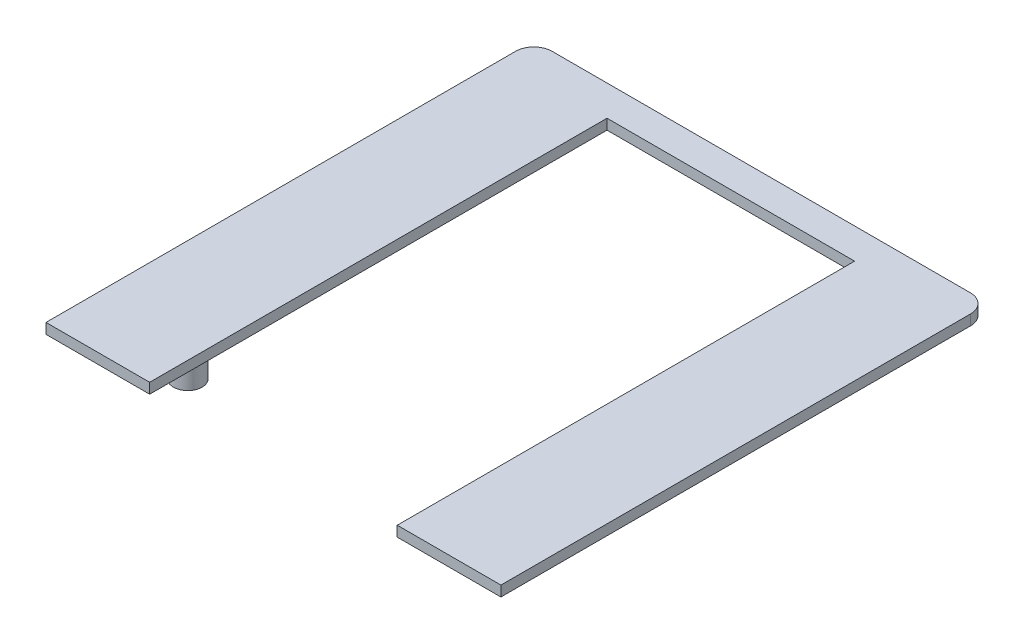
ISO-10303-21;
HEADER;
FILE_DESCRIPTION(('STEP AP214'),'2;1');
FILE_NAME('part.step','',(''),(''),'','','');
FILE_SCHEMA(('AUTOMOTIVE_DESIGN { 1 0 10303 214 1 1 1 1 }'));
ENDSEC;
DATA;
#1=APPLICATION_CONTEXT('core data for automotive mechanical design processes');
#2=APPLICATION_PROTOCOL_DEFINITION('international standard','automotive_design',2000,#1);
#3=PRODUCT_CONTEXT('',#1,'mechanical');
#4=PRODUCT('Part','Part','',(#3));
#5=PRODUCT_RELATED_PRODUCT_CATEGORY('part','',(#4));
#6=PRODUCT_DEFINITION_FORMATION('','',#4);
#7=PRODUCT_DEFINITION_CONTEXT('part definition',#1,'design');
#8=PRODUCT_DEFINITION('design','',#6,#7);
#9=PRODUCT_DEFINITION_SHAPE('','',#8);
#10=(LENGTH_UNIT() NAMED_UNIT(*) SI_UNIT(.MILLI.,.METRE.));
#11=(NAMED_UNIT(*) PLANE_ANGLE_UNIT() SI_UNIT($,.RADIAN.));
#12=(NAMED_UNIT(*) SI_UNIT($,.STERADIAN.) SOLID_ANGLE_UNIT());
#13=UNCERTAINTY_MEASURE_WITH_UNIT(LENGTH_MEASURE(1.E-05),#10,'distance_accuracy_value','');
#14=(GEOMETRIC_REPRESENTATION_CONTEXT(3) GLOBAL_UNCERTAINTY_ASSIGNED_CONTEXT((#13)) GLOBAL_UNIT_ASSIGNED_CONTEXT((#10,
#11,#12)) REPRESENTATION_CONTEXT('',''));
#15=CARTESIAN_POINT('',(0.,0.,0.));
#16=DIRECTION('',(0.,0.,1.));
#17=DIRECTION('',(1.,0.,0.));
#18=AXIS2_PLACEMENT_3D('',#15,#16,#17);
#19=CARTESIAN_POINT('',(17.,1.7,0.));
#20=DIRECTION('',(0.,0.,-1.));
#21=DIRECTION('',(-1.,0.,0.));
#22=AXIS2_PLACEMENT_3D('',#19,#20,#21);
#23=PLANE('',#22);
#24=DIRECTION('',(1.,0.,0.));
#25=VECTOR('',#24,1.);
#26=CARTESIAN_POINT('',(17.,0.,0.));
#27=LINE('',#26,#25);
#28=CARTESIAN_POINT('',(0.,0.,0.));
#29=VERTEX_POINT('',#28);
#30=CARTESIAN_POINT('',(17.,0.,0.));
#31=VERTEX_POINT('',#30);
#32=EDGE_CURVE('E183',#29,#31,#27,.T.);
#33=ORIENTED_EDGE('',*,*,#32,.T.);
#34=DIRECTION('',(0.,-1.,0.));
#35=VECTOR('',#34,1.);
#36=CARTESIAN_POINT('',(17.,1.7,0.));
#37=LINE('',#36,#35);
#38=CARTESIAN_POINT('',(17.,1.7,0.));
#39=VERTEX_POINT('',#38);
#40=EDGE_CURVE('E212',#39,#31,#37,.T.);
#41=ORIENTED_EDGE('',*,*,#40,.F.);
#42=DIRECTION('',(1.,0.,0.));
#43=VECTOR('',#42,1.);
#44=CARTESIAN_POINT('',(17.,1.7,0.));
#45=LINE('',#44,#43);
#46=CARTESIAN_POINT('',(0.,1.7,0.));
#47=VERTEX_POINT('',#46);
#48=EDGE_CURVE('E186',#47,#39,#45,.T.);
#49=ORIENTED_EDGE('',*,*,#48,.F.);
#50=DIRECTION('',(0.,-1.,0.));
#51=VECTOR('',#50,1.);
#52=CARTESIAN_POINT('',(0.,1.7,0.));
#53=LINE('',#52,#51);
#54=EDGE_CURVE('E197',#47,#29,#53,.T.);
#55=ORIENTED_EDGE('',*,*,#54,.T.);
#56=EDGE_LOOP('',(#33,#41,#49,#55));
#57=FACE_BOUND('',#56,.T.);
#58=ADVANCED_FACE('F40',(#57),#23,.F.);
#59=CARTESIAN_POINT('',(17.,1.7,-75.));
#60=DIRECTION('',(-1.,0.,0.));
#61=DIRECTION('',(0.,0.,1.));
#62=AXIS2_PLACEMENT_3D('',#59,#60,#61);
#63=PLANE('',#62);
#64=DIRECTION('',(0.,0.,-1.));
#65=VECTOR('',#64,1.);
#66=CARTESIAN_POINT('',(17.,0.,-75.));
#67=LINE('',#66,#65);
#68=CARTESIAN_POINT('',(17.,0.,-75.));
#69=VERTEX_POINT('',#68);
#70=EDGE_CURVE('E200',#31,#69,#67,.T.);
#71=ORIENTED_EDGE('',*,*,#70,.T.);
#72=DIRECTION('',(0.,-1.,0.));
#73=VECTOR('',#72,1.);
#74=CARTESIAN_POINT('',(17.,1.7,-75.));
#75=LINE('',#74,#73);
#76=CARTESIAN_POINT('',(17.,1.7,-75.));
#77=VERTEX_POINT('',#76);
#78=EDGE_CURVE('E209',#77,#69,#75,.T.);
#79=ORIENTED_EDGE('',*,*,#78,.F.);
#80=DIRECTION('',(0.,0.,-1.));
#81=VECTOR('',#80,1.);
#82=CARTESIAN_POINT('',(17.,1.7,-75.));
#83=LINE('',#82,#81);
#84=EDGE_CURVE('E189',#39,#77,#83,.T.);
#85=ORIENTED_EDGE('',*,*,#84,.F.);
#86=ORIENTED_EDGE('',*,*,#40,.T.);
#87=EDGE_LOOP('',(#71,#79,#85,#86));
#88=FACE_BOUND('',#87,.T.);
#89=ADVANCED_FACE('F248',(#88),#63,.F.);
#90=CARTESIAN_POINT('',(37.3,1.7,-75.));
#91=DIRECTION('',(0.,0.,-1.));
#92=DIRECTION('',(-1.,0.,0.));
#93=AXIS2_PLACEMENT_3D('',#90,#91,#92);
#94=PLANE('',#93);
#95=DIRECTION('',(1.,0.,0.));
#96=VECTOR('',#95,1.);
#97=CARTESIAN_POINT('',(37.3,0.,-75.));
#98=LINE('',#97,#96);
#99=CARTESIAN_POINT('',(57.6,0.,-75.));
#100=VERTEX_POINT('',#99);
#101=EDGE_CURVE('E202',#69,#100,#98,.T.);
#102=ORIENTED_EDGE('',*,*,#101,.T.);
#103=DIRECTION('',(0.,-1.,0.));
#104=VECTOR('',#103,1.);
#105=CARTESIAN_POINT('',(57.6,1.7,-75.));
#106=LINE('',#105,#104);
#107=CARTESIAN_POINT('',(57.6,1.7,-75.));
#108=VERTEX_POINT('',#107);
#109=EDGE_CURVE('E138',#108,#100,#106,.T.);
#110=ORIENTED_EDGE('',*,*,#109,.F.);
#111=DIRECTION('',(1.,0.,0.));
#112=VECTOR('',#111,1.);
#113=CARTESIAN_POINT('',(37.3,1.7,-75.));
#114=LINE('',#113,#112);
#115=EDGE_CURVE('E123',#77,#108,#114,.T.);
#116=ORIENTED_EDGE('',*,*,#115,.F.);
#117=ORIENTED_EDGE('',*,*,#78,.T.);
#118=EDGE_LOOP('',(#102,#110,#116,#117));
#119=FACE_BOUND('',#118,.T.);
#120=ADVANCED_FACE('F252',(#119),#94,.F.);
#121=CARTESIAN_POINT('',(0.,1.7,-80.));
#122=DIRECTION('',(0.,0.,1.));
#123=DIRECTION('',(1.,0.,0.));
#124=AXIS2_PLACEMENT_3D('',#121,#122,#123);
#125=PLANE('',#124);
#126=DIRECTION('',(-1.,0.,0.));
#127=VECTOR('',#126,1.);
#128=CARTESIAN_POINT('',(0.,0.,-80.));
#129=LINE('',#128,#127);
#130=CARTESIAN_POINT('',(71.6,0.,-80.));
#131=VERTEX_POINT('',#130);
#132=CARTESIAN_POINT('',(3.,0.,-80.));
#133=VERTEX_POINT('',#132);
#134=EDGE_CURVE('E204',#131,#133,#129,.T.);
#135=ORIENTED_EDGE('',*,*,#134,.T.);
#136=DIRECTION('',(0.,-1.,0.));
#137=VECTOR('',#136,1.);
#138=CARTESIAN_POINT('',(3.,1.7,-80.));
#139=LINE('',#138,#137);
#140=CARTESIAN_POINT('',(3.,1.7,-80.));
#141=VERTEX_POINT('',#140);
#142=EDGE_CURVE('E48',#133,#141,#139,.F.);
#143=ORIENTED_EDGE('',*,*,#142,.T.);
#144=DIRECTION('',(-1.,0.,0.));
#145=VECTOR('',#144,1.);
#146=CARTESIAN_POINT('',(0.,1.7,-80.));
#147=LINE('',#146,#145);
#148=CARTESIAN_POINT('',(71.6,1.7,-80.));
#149=VERTEX_POINT('',#148);
#150=EDGE_CURVE('E193',#149,#141,#147,.T.);
#151=ORIENTED_EDGE('',*,*,#150,.F.);
#152=DIRECTION('',(0.,-1.,0.));
#153=VECTOR('',#152,1.);
#154=CARTESIAN_POINT('',(71.6,1.7,-80.));
#155=LINE('',#154,#153);
#156=EDGE_CURVE('E162',#131,#149,#155,.F.);
#157=ORIENTED_EDGE('',*,*,#156,.F.);
#158=EDGE_LOOP('',(#135,#143,#151,#157));
#159=FACE_BOUND('',#158,.T.);
#160=ADVANCED_FACE('F258',(#159),#125,.F.);
#161=CARTESIAN_POINT('',(0.,1.7,0.));
#162=DIRECTION('',(1.,0.,0.));
#163=DIRECTION('',(0.,0.,-1.));
#164=AXIS2_PLACEMENT_3D('',#161,#162,#163);
#165=PLANE('',#164);
#166=DIRECTION('',(0.,0.,1.));
#167=VECTOR('',#166,1.);
#168=CARTESIAN_POINT('',(0.,1.7,0.));
#169=LINE('',#168,#167);
#170=CARTESIAN_POINT('',(0.,1.7,-77.));
#171=VERTEX_POINT('',#170);
#172=EDGE_CURVE('E195',#171,#47,#169,.T.);
#173=ORIENTED_EDGE('',*,*,#172,.F.);
#174=DIRECTION('',(0.,-1.,0.));
#175=VECTOR('',#174,1.);
#176=CARTESIAN_POINT('',(0.,1.7,-77.));
#177=LINE('',#176,#175);
#178=CARTESIAN_POINT('',(0.,0.,-77.));
#179=VERTEX_POINT('',#178);
#180=EDGE_CURVE('E215',#171,#179,#177,.T.);
#181=ORIENTED_EDGE('',*,*,#180,.T.);
#182=DIRECTION('',(0.,0.,1.));
#183=VECTOR('',#182,1.);
#184=CARTESIAN_POINT('',(0.,0.,0.));
#185=LINE('',#184,#183);
#186=EDGE_CURVE('E190',#179,#29,#185,.T.);
#187=ORIENTED_EDGE('',*,*,#186,.T.);
#188=ORIENTED_EDGE('',*,*,#54,.F.);
#189=EDGE_LOOP('',(#173,#181,#187,#188));
#190=FACE_BOUND('',#189,.T.);
#191=ADVANCED_FACE('F221',(#190),#165,.F.);
#192=CARTESIAN_POINT('',(0.,1.7,0.));
#193=DIRECTION('',(0.,-1.,0.));
#194=DIRECTION('',(0.,0.,-1.));
#195=AXIS2_PLACEMENT_3D('',#192,#193,#194);
#196=PLANE('',#195);
#197=ORIENTED_EDGE('',*,*,#150,.T.);
#198=CARTESIAN_POINT('',(3.,1.7,-77.));
#199=DIRECTION('',(0.,-1.,0.));
#200=DIRECTION('',(0.,0.,-1.));
#201=AXIS2_PLACEMENT_3D('',#198,#199,#200);
#202=CIRCLE('',#201,3.);
#203=EDGE_CURVE('E11',#141,#171,#202,.F.);
#204=ORIENTED_EDGE('',*,*,#203,.T.);
#205=ORIENTED_EDGE('',*,*,#172,.T.);
#206=ORIENTED_EDGE('',*,*,#48,.T.);
#207=ORIENTED_EDGE('',*,*,#84,.T.);
#208=ORIENTED_EDGE('',*,*,#115,.T.);
#209=DIRECTION('',(0.,0.,-1.));
#210=VECTOR('',#209,1.);
#211=CARTESIAN_POINT('',(57.6,1.7,-75.));
#212=LINE('',#211,#210);
#213=CARTESIAN_POINT('',(57.6,1.7,0.));
#214=VERTEX_POINT('',#213);
#215=EDGE_CURVE('E115',#214,#108,#212,.T.);
#216=ORIENTED_EDGE('',*,*,#215,.F.);
#217=DIRECTION('',(-1.,0.,0.));
#218=VECTOR('',#217,1.);
#219=CARTESIAN_POINT('',(57.6,1.7,0.));
#220=LINE('',#219,#218);
#221=CARTESIAN_POINT('',(74.6,1.7,0.));
#222=VERTEX_POINT('',#221);
#223=EDGE_CURVE('E120',#222,#214,#220,.T.);
#224=ORIENTED_EDGE('',*,*,#223,.F.);
#225=DIRECTION('',(0.,0.,1.));
#226=VECTOR('',#225,1.);
#227=CARTESIAN_POINT('',(74.6,1.7,0.));
#228=LINE('',#227,#226);
#229=CARTESIAN_POINT('',(74.6,1.7,-77.));
#230=VERTEX_POINT('',#229);
#231=EDGE_CURVE('E127',#230,#222,#228,.T.);
#232=ORIENTED_EDGE('',*,*,#231,.F.);
#233=CARTESIAN_POINT('',(71.6,1.7,-77.));
#234=DIRECTION('',(0.,1.,0.));
#235=DIRECTION('',(0.,0.,-1.));
#236=AXIS2_PLACEMENT_3D('',#233,#234,#235);
#237=CIRCLE('',#236,3.);
#238=EDGE_CURVE('E165',#149,#230,#237,.F.);
#239=ORIENTED_EDGE('',*,*,#238,.F.);
#240=EDGE_LOOP('',(#197,#204,#205,#206,#207,#208,#216,#224,#232,#239));
#241=FACE_BOUND('',#240,.T.);
#242=ADVANCED_FACE('F117',(#241),#196,.F.);
#243=CARTESIAN_POINT('',(0.,0.,0.));
#244=DIRECTION('',(0.,-1.,0.));
#245=DIRECTION('',(0.,0.,-1.));
#246=AXIS2_PLACEMENT_3D('',#243,#244,#245);
#247=PLANE('',#246);
#248=CARTESIAN_POINT('',(13.25,0.,-61.25));
#249=DIRECTION('',(0.,-1.,0.));
#250=DIRECTION('',(0.,0.,-1.));
#251=AXIS2_PLACEMENT_3D('',#248,#249,#250);
#252=CIRCLE('',#251,2.4);
#253=CARTESIAN_POINT('',(13.25,0.,-63.65));
#254=VERTEX_POINT('',#253);
#255=EDGE_CURVE('E167',#254,#254,#252,.T.);
#256=ORIENTED_EDGE('',*,*,#255,.F.);
#257=EDGE_LOOP('',(#256));
#258=FACE_BOUND('',#257,.T.);
#259=CARTESIAN_POINT('',(8.,0.,-72.));
#260=DIRECTION('',(0.,-1.,0.));
#261=DIRECTION('',(0.,0.,-1.));
#262=AXIS2_PLACEMENT_3D('',#259,#260,#261);
#263=CIRCLE('',#262,2.35);
#264=CARTESIAN_POINT('',(8.,0.,-74.35));
#265=VERTEX_POINT('',#264);
#266=EDGE_CURVE('E174',#265,#265,#263,.T.);
#267=ORIENTED_EDGE('',*,*,#266,.F.);
#268=EDGE_LOOP('',(#267));
#269=FACE_BOUND('',#268,.T.);
#270=CARTESIAN_POINT('',(13.25,0.,-10.));
#271=DIRECTION('',(0.,-1.,0.));
#272=DIRECTION('',(0.,0.,-1.));
#273=AXIS2_PLACEMENT_3D('',#270,#271,#272);
#274=CIRCLE('',#273,2.35);
#275=CARTESIAN_POINT('',(13.25,0.,-12.35));
#276=VERTEX_POINT('',#275);
#277=EDGE_CURVE('E177',#276,#276,#274,.T.);
#278=ORIENTED_EDGE('',*,*,#277,.F.);
#279=EDGE_LOOP('',(#278));
#280=FACE_BOUND('',#279,.T.);
#281=ORIENTED_EDGE('',*,*,#186,.F.);
#282=CARTESIAN_POINT('',(3.,0.,-77.));
#283=DIRECTION('',(0.,-1.,0.));
#284=DIRECTION('',(0.,0.,-1.));
#285=AXIS2_PLACEMENT_3D('',#282,#283,#284);
#286=CIRCLE('',#285,3.);
#287=EDGE_CURVE('E62',#179,#133,#286,.T.);
#288=ORIENTED_EDGE('',*,*,#287,.T.);
#289=ORIENTED_EDGE('',*,*,#134,.F.);
#290=CARTESIAN_POINT('',(71.6,0.,-77.));
#291=DIRECTION('',(0.,1.,0.));
#292=DIRECTION('',(0.,0.,-1.));
#293=AXIS2_PLACEMENT_3D('',#290,#291,#292);
#294=CIRCLE('',#293,3.);
#295=CARTESIAN_POINT('',(74.6,0.,-77.));
#296=VERTEX_POINT('',#295);
#297=EDGE_CURVE('E159',#296,#131,#294,.T.);
#298=ORIENTED_EDGE('',*,*,#297,.F.);
#299=DIRECTION('',(0.,0.,1.));
#300=VECTOR('',#299,1.);
#301=CARTESIAN_POINT('',(74.6,0.,0.));
#302=LINE('',#301,#300);
#303=CARTESIAN_POINT('',(74.6,0.,0.));
#304=VERTEX_POINT('',#303);
#305=EDGE_CURVE('E143',#296,#304,#302,.T.);
#306=ORIENTED_EDGE('',*,*,#305,.T.);
#307=DIRECTION('',(-1.,0.,0.));
#308=VECTOR('',#307,1.);
#309=CARTESIAN_POINT('',(57.6,0.,0.));
#310=LINE('',#309,#308);
#311=CARTESIAN_POINT('',(57.6,0.,0.));
#312=VERTEX_POINT('',#311);
#313=EDGE_CURVE('E151',#304,#312,#310,.T.);
#314=ORIENTED_EDGE('',*,*,#313,.T.);
#315=DIRECTION('',(0.,0.,-1.));
#316=VECTOR('',#315,1.);
#317=CARTESIAN_POINT('',(57.6,0.,-75.));
#318=LINE('',#317,#316);
#319=EDGE_CURVE('E133',#312,#100,#318,.T.);
#320=ORIENTED_EDGE('',*,*,#319,.T.);
#321=ORIENTED_EDGE('',*,*,#101,.F.);
#322=ORIENTED_EDGE('',*,*,#70,.F.);
#323=ORIENTED_EDGE('',*,*,#32,.F.);
#324=EDGE_LOOP('',(#281,#288,#289,#298,#306,#314,#320,#321,#322,#323));
#325=FACE_BOUND('',#324,.T.);
#326=CARTESIAN_POINT('',(61.35,0.,-61.25));
#327=DIRECTION('',(0.,1.,0.));
#328=DIRECTION('',(0.,0.,-1.));
#329=AXIS2_PLACEMENT_3D('',#326,#327,#328);
#330=CIRCLE('',#329,2.4);
#331=CARTESIAN_POINT('',(61.35,0.,-63.65));
#332=VERTEX_POINT('',#331);
#333=EDGE_CURVE('E324',#332,#332,#330,.T.);
#334=ORIENTED_EDGE('',*,*,#333,.T.);
#335=EDGE_LOOP('',(#334));
#336=FACE_BOUND('',#335,.T.);
#337=CARTESIAN_POINT('',(66.6,0.,-72.));
#338=DIRECTION('',(0.,1.,0.));
#339=DIRECTION('',(0.,0.,-1.));
#340=AXIS2_PLACEMENT_3D('',#337,#338,#339);
#341=CIRCLE('',#340,2.35);
#342=CARTESIAN_POINT('',(66.6,0.,-74.35));
#343=VERTEX_POINT('',#342);
#344=EDGE_CURVE('E327',#343,#343,#341,.T.);
#345=ORIENTED_EDGE('',*,*,#344,.T.);
#346=EDGE_LOOP('',(#345));
#347=FACE_BOUND('',#346,.T.);
#348=CARTESIAN_POINT('',(61.35,0.,-10.));
#349=DIRECTION('',(0.,1.,0.));
#350=DIRECTION('',(0.,0.,-1.));
#351=AXIS2_PLACEMENT_3D('',#348,#349,#350);
#352=CIRCLE('',#351,2.35);
#353=CARTESIAN_POINT('',(61.35,0.,-12.35));
#354=VERTEX_POINT('',#353);
#355=EDGE_CURVE('E147',#354,#354,#352,.T.);
#356=ORIENTED_EDGE('',*,*,#355,.T.);
#357=EDGE_LOOP('',(#356));
#358=FACE_BOUND('',#357,.T.);
#359=ADVANCED_FACE('F226',(#258,#269,#280,#325,#336,#347,#358),#247,.T.);
#360=CARTESIAN_POINT('',(13.25,-4.7,-10.));
#361=DIRECTION('',(0.,1.,0.));
#362=DIRECTION('',(0.,0.,1.));
#363=AXIS2_PLACEMENT_3D('',#360,#361,#362);
#364=CYLINDRICAL_SURFACE('',#363,2.35);
#365=CARTESIAN_POINT('',(13.25,-4.7,-10.));
#366=DIRECTION('',(0.,-1.,0.));
#367=DIRECTION('',(0.,0.,-1.));
#368=AXIS2_PLACEMENT_3D('',#365,#366,#367);
#369=CIRCLE('',#368,2.35);
#370=CARTESIAN_POINT('',(13.25,-4.7,-12.35));
#371=VERTEX_POINT('',#370);
#372=EDGE_CURVE('E180',#371,#371,#369,.T.);
#373=ORIENTED_EDGE('',*,*,#372,.F.);
#374=EDGE_LOOP('',(#373));
#375=FACE_BOUND('',#374,.T.);
#376=ORIENTED_EDGE('',*,*,#277,.T.);
#377=EDGE_LOOP('',(#376));
#378=FACE_BOUND('',#377,.T.);
#379=ADVANCED_FACE('F266',(#375,#378),#364,.T.);
#380=CARTESIAN_POINT('',(13.25,-4.7,-10.));
#381=DIRECTION('',(0.,-1.,0.));
#382=DIRECTION('',(0.,0.,-1.));
#383=AXIS2_PLACEMENT_3D('',#380,#381,#382);
#384=PLANE('',#383);
#385=ORIENTED_EDGE('',*,*,#372,.T.);
#386=EDGE_LOOP('',(#385));
#387=FACE_BOUND('',#386,.T.);
#388=ADVANCED_FACE('F272',(#387),#384,.T.);
#389=CARTESIAN_POINT('',(8.,-4.7,-72.));
#390=DIRECTION('',(0.,1.,0.));
#391=DIRECTION('',(0.,0.,1.));
#392=AXIS2_PLACEMENT_3D('',#389,#390,#391);
#393=CYLINDRICAL_SURFACE('',#392,2.35);
#394=CARTESIAN_POINT('',(8.,-4.7,-72.));
#395=DIRECTION('',(0.,-1.,0.));
#396=DIRECTION('',(0.,0.,-1.));
#397=AXIS2_PLACEMENT_3D('',#394,#395,#396);
#398=CIRCLE('',#397,2.35);
#399=CARTESIAN_POINT('',(8.,-4.7,-74.35));
#400=VERTEX_POINT('',#399);
#401=EDGE_CURVE('E171',#400,#400,#398,.T.);
#402=ORIENTED_EDGE('',*,*,#401,.F.);
#403=EDGE_LOOP('',(#402));
#404=FACE_BOUND('',#403,.T.);
#405=ORIENTED_EDGE('',*,*,#266,.T.);
#406=EDGE_LOOP('',(#405));
#407=FACE_BOUND('',#406,.T.);
#408=ADVANCED_FACE('F244',(#404,#407),#393,.T.);
#409=CARTESIAN_POINT('',(8.,-4.7,-72.));
#410=DIRECTION('',(0.,-1.,0.));
#411=DIRECTION('',(0.,0.,-1.));
#412=AXIS2_PLACEMENT_3D('',#409,#410,#411);
#413=PLANE('',#412);
#414=ORIENTED_EDGE('',*,*,#401,.T.);
#415=EDGE_LOOP('',(#414));
#416=FACE_BOUND('',#415,.T.);
#417=ADVANCED_FACE('F236',(#416),#413,.T.);
#418=CARTESIAN_POINT('',(3.,1.7,-77.));
#419=DIRECTION('',(0.,-1.,0.));
#420=DIRECTION('',(0.,0.,-1.));
#421=AXIS2_PLACEMENT_3D('',#418,#419,#420);
#422=CYLINDRICAL_SURFACE('',#421,3.);
#423=ORIENTED_EDGE('',*,*,#203,.F.);
#424=ORIENTED_EDGE('',*,*,#142,.F.);
#425=ORIENTED_EDGE('',*,*,#287,.F.);
#426=ORIENTED_EDGE('',*,*,#180,.F.);
#427=EDGE_LOOP('',(#423,#424,#425,#426));
#428=FACE_BOUND('',#427,.T.);
#429=ADVANCED_FACE('F42',(#428),#422,.T.);
#430=CARTESIAN_POINT('',(13.25,1.,-61.25));
#431=DIRECTION('',(0.,-1.,0.));
#432=DIRECTION('',(0.,0.,-1.));
#433=AXIS2_PLACEMENT_3D('',#430,#431,#432);
#434=CYLINDRICAL_SURFACE('',#433,2.4);
#435=CARTESIAN_POINT('',(13.25,1.,-61.25));
#436=DIRECTION('',(0.,-1.,0.));
#437=DIRECTION('',(0.,0.,-1.));
#438=AXIS2_PLACEMENT_3D('',#435,#436,#437);
#439=CIRCLE('',#438,2.4);
#440=CARTESIAN_POINT('',(13.25,1.,-63.65));
#441=VERTEX_POINT('',#440);
#442=EDGE_CURVE('E168',#441,#441,#439,.T.);
#443=ORIENTED_EDGE('',*,*,#442,.F.);
#444=EDGE_LOOP('',(#443));
#445=FACE_BOUND('',#444,.T.);
#446=ORIENTED_EDGE('',*,*,#255,.T.);
#447=EDGE_LOOP('',(#446));
#448=FACE_BOUND('',#447,.T.);
#449=ADVANCED_FACE('F235',(#445,#448),#434,.F.);
#450=CARTESIAN_POINT('',(13.25,1.,-61.25));
#451=DIRECTION('',(0.,-1.,0.));
#452=DIRECTION('',(0.,0.,-1.));
#453=AXIS2_PLACEMENT_3D('',#450,#451,#452);
#454=PLANE('',#453);
#455=ORIENTED_EDGE('',*,*,#442,.T.);
#456=EDGE_LOOP('',(#455));
#457=FACE_BOUND('',#456,.T.);
#458=ADVANCED_FACE('F241',(#457),#454,.T.);
#459=CARTESIAN_POINT('',(57.6,1.7,0.));
#460=DIRECTION('',(0.,0.,-1.));
#461=DIRECTION('',(1.,0.,0.));
#462=AXIS2_PLACEMENT_3D('',#459,#460,#461);
#463=PLANE('',#462);
#464=ORIENTED_EDGE('',*,*,#313,.F.);
#465=DIRECTION('',(0.,-1.,0.));
#466=VECTOR('',#465,1.);
#467=CARTESIAN_POINT('',(74.6,1.7,0.));
#468=LINE('',#467,#466);
#469=EDGE_CURVE('E142',#222,#304,#468,.T.);
#470=ORIENTED_EDGE('',*,*,#469,.F.);
#471=ORIENTED_EDGE('',*,*,#223,.T.);
#472=DIRECTION('',(0.,-1.,0.));
#473=VECTOR('',#472,1.);
#474=CARTESIAN_POINT('',(57.6,1.7,0.));
#475=LINE('',#474,#473);
#476=EDGE_CURVE('E130',#214,#312,#475,.T.);
#477=ORIENTED_EDGE('',*,*,#476,.T.);
#478=EDGE_LOOP('',(#464,#470,#471,#477));
#479=FACE_BOUND('',#478,.T.);
#480=ADVANCED_FACE('F140',(#479),#463,.F.);
#481=CARTESIAN_POINT('',(57.6,1.7,-75.));
#482=DIRECTION('',(1.,0.,0.));
#483=DIRECTION('',(0.,0.,1.));
#484=AXIS2_PLACEMENT_3D('',#481,#482,#483);
#485=PLANE('',#484);
#486=ORIENTED_EDGE('',*,*,#319,.F.);
#487=ORIENTED_EDGE('',*,*,#476,.F.);
#488=ORIENTED_EDGE('',*,*,#215,.T.);
#489=ORIENTED_EDGE('',*,*,#109,.T.);
#490=EDGE_LOOP('',(#486,#487,#488,#489));
#491=FACE_BOUND('',#490,.T.);
#492=ADVANCED_FACE('F131',(#491),#485,.F.);
#493=CARTESIAN_POINT('',(74.6,1.7,0.));
#494=DIRECTION('',(-1.,0.,0.));
#495=DIRECTION('',(0.,0.,-1.));
#496=AXIS2_PLACEMENT_3D('',#493,#494,#495);
#497=PLANE('',#496);
#498=ORIENTED_EDGE('',*,*,#231,.T.);
#499=ORIENTED_EDGE('',*,*,#469,.T.);
#500=ORIENTED_EDGE('',*,*,#305,.F.);
#501=DIRECTION('',(0.,-1.,0.));
#502=VECTOR('',#501,1.);
#503=CARTESIAN_POINT('',(74.6,1.7,-77.));
#504=LINE('',#503,#502);
#505=EDGE_CURVE('E137',#230,#296,#504,.T.);
#506=ORIENTED_EDGE('',*,*,#505,.F.);
#507=EDGE_LOOP('',(#498,#499,#500,#506));
#508=FACE_BOUND('',#507,.T.);
#509=ADVANCED_FACE('F293',(#508),#497,.F.);
#510=CARTESIAN_POINT('',(61.35,-4.7,-10.));
#511=DIRECTION('',(0.,1.,0.));
#512=DIRECTION('',(0.,0.,1.));
#513=AXIS2_PLACEMENT_3D('',#510,#511,#512);
#514=CYLINDRICAL_SURFACE('',#513,2.35);
#515=CARTESIAN_POINT('',(61.35,-4.7,-10.));
#516=DIRECTION('',(0.,1.,0.));
#517=DIRECTION('',(0.,0.,-1.));
#518=AXIS2_PLACEMENT_3D('',#515,#516,#517);
#519=CIRCLE('',#518,2.35);
#520=CARTESIAN_POINT('',(61.35,-4.7,-12.35));
#521=VERTEX_POINT('',#520);
#522=EDGE_CURVE('E153',#521,#521,#519,.T.);
#523=ORIENTED_EDGE('',*,*,#522,.T.);
#524=EDGE_LOOP('',(#523));
#525=FACE_BOUND('',#524,.T.);
#526=ORIENTED_EDGE('',*,*,#355,.F.);
#527=EDGE_LOOP('',(#526));
#528=FACE_BOUND('',#527,.T.);
#529=ADVANCED_FACE('F296',(#525,#528),#514,.T.);
#530=CARTESIAN_POINT('',(61.35,-4.7,-10.));
#531=DIRECTION('',(0.,-1.,0.));
#532=DIRECTION('',(0.,0.,-1.));
#533=AXIS2_PLACEMENT_3D('',#530,#531,#532);
#534=PLANE('',#533);
#535=ORIENTED_EDGE('',*,*,#522,.F.);
#536=EDGE_LOOP('',(#535));
#537=FACE_BOUND('',#536,.T.);
#538=ADVANCED_FACE('F300',(#537),#534,.T.);
#539=CARTESIAN_POINT('',(66.6,-4.7,-72.));
#540=DIRECTION('',(0.,1.,0.));
#541=DIRECTION('',(0.,0.,1.));
#542=AXIS2_PLACEMENT_3D('',#539,#540,#541);
#543=CYLINDRICAL_SURFACE('',#542,2.35);
#544=CARTESIAN_POINT('',(66.6,-4.7,-72.));
#545=DIRECTION('',(0.,1.,0.));
#546=DIRECTION('',(0.,0.,-1.));
#547=AXIS2_PLACEMENT_3D('',#544,#545,#546);
#548=CIRCLE('',#547,2.35);
#549=CARTESIAN_POINT('',(66.6,-4.7,-74.35));
#550=VERTEX_POINT('',#549);
#551=EDGE_CURVE('E323',#550,#550,#548,.T.);
#552=ORIENTED_EDGE('',*,*,#551,.T.);
#553=EDGE_LOOP('',(#552));
#554=FACE_BOUND('',#553,.T.);
#555=ORIENTED_EDGE('',*,*,#344,.F.);
#556=EDGE_LOOP('',(#555));
#557=FACE_BOUND('',#556,.T.);
#558=ADVANCED_FACE('F304',(#554,#557),#543,.T.);
#559=CARTESIAN_POINT('',(66.6,-4.7,-72.));
#560=DIRECTION('',(0.,-1.,0.));
#561=DIRECTION('',(0.,0.,-1.));
#562=AXIS2_PLACEMENT_3D('',#559,#560,#561);
#563=PLANE('',#562);
#564=ORIENTED_EDGE('',*,*,#551,.F.);
#565=EDGE_LOOP('',(#564));
#566=FACE_BOUND('',#565,.T.);
#567=ADVANCED_FACE('F287',(#566),#563,.T.);
#568=CARTESIAN_POINT('',(71.6,1.7,-77.));
#569=DIRECTION('',(0.,-1.,0.));
#570=DIRECTION('',(0.,0.,-1.));
#571=AXIS2_PLACEMENT_3D('',#568,#569,#570);
#572=CYLINDRICAL_SURFACE('',#571,3.);
#573=ORIENTED_EDGE('',*,*,#238,.T.);
#574=ORIENTED_EDGE('',*,*,#505,.T.);
#575=ORIENTED_EDGE('',*,*,#297,.T.);
#576=ORIENTED_EDGE('',*,*,#156,.T.);
#577=EDGE_LOOP('',(#573,#574,#575,#576));
#578=FACE_BOUND('',#577,.T.);
#579=ADVANCED_FACE('F283',(#578),#572,.T.);
#580=CARTESIAN_POINT('',(61.35,1.,-61.25));
#581=DIRECTION('',(0.,-1.,0.));
#582=DIRECTION('',(0.,0.,-1.));
#583=AXIS2_PLACEMENT_3D('',#580,#581,#582);
#584=CYLINDRICAL_SURFACE('',#583,2.4);
#585=CARTESIAN_POINT('',(61.35,1.,-61.25));
#586=DIRECTION('',(0.,1.,0.));
#587=DIRECTION('',(0.,0.,-1.));
#588=AXIS2_PLACEMENT_3D('',#585,#586,#587);
#589=CIRCLE('',#588,2.4);
#590=CARTESIAN_POINT('',(61.35,1.,-63.65));
#591=VERTEX_POINT('',#590);
#592=EDGE_CURVE('E322',#591,#591,#589,.T.);
#593=ORIENTED_EDGE('',*,*,#592,.T.);
#594=EDGE_LOOP('',(#593));
#595=FACE_BOUND('',#594,.T.);
#596=ORIENTED_EDGE('',*,*,#333,.F.);
#597=EDGE_LOOP('',(#596));
#598=FACE_BOUND('',#597,.T.);
#599=ADVANCED_FACE('F286',(#595,#598),#584,.F.);
#600=CARTESIAN_POINT('',(61.35,1.,-61.25));
#601=DIRECTION('',(0.,-1.,0.));
#602=DIRECTION('',(0.,0.,-1.));
#603=AXIS2_PLACEMENT_3D('',#600,#601,#602);
#604=PLANE('',#603);
#605=ORIENTED_EDGE('',*,*,#592,.F.);
#606=EDGE_LOOP('',(#605));
#607=FACE_BOUND('',#606,.T.);
#608=ADVANCED_FACE('F314',(#607),#604,.T.);
#609=CLOSED_SHELL('',(#58,#89,#120,#160,#191,#242,#359,#379,#388,#408,#417,#429,#449,#458,#480,
#492,#509,#529,#538,#558,#567,#579,#599,#608));
#610=MANIFOLD_SOLID_BREP('B2',#609);
#611=ADVANCED_BREP_SHAPE_REPRESENTATION('',(#18,#610),#14);
#612=SHAPE_DEFINITION_REPRESENTATION(#9,#611);
ENDSEC;
END-ISO-10303-21;
